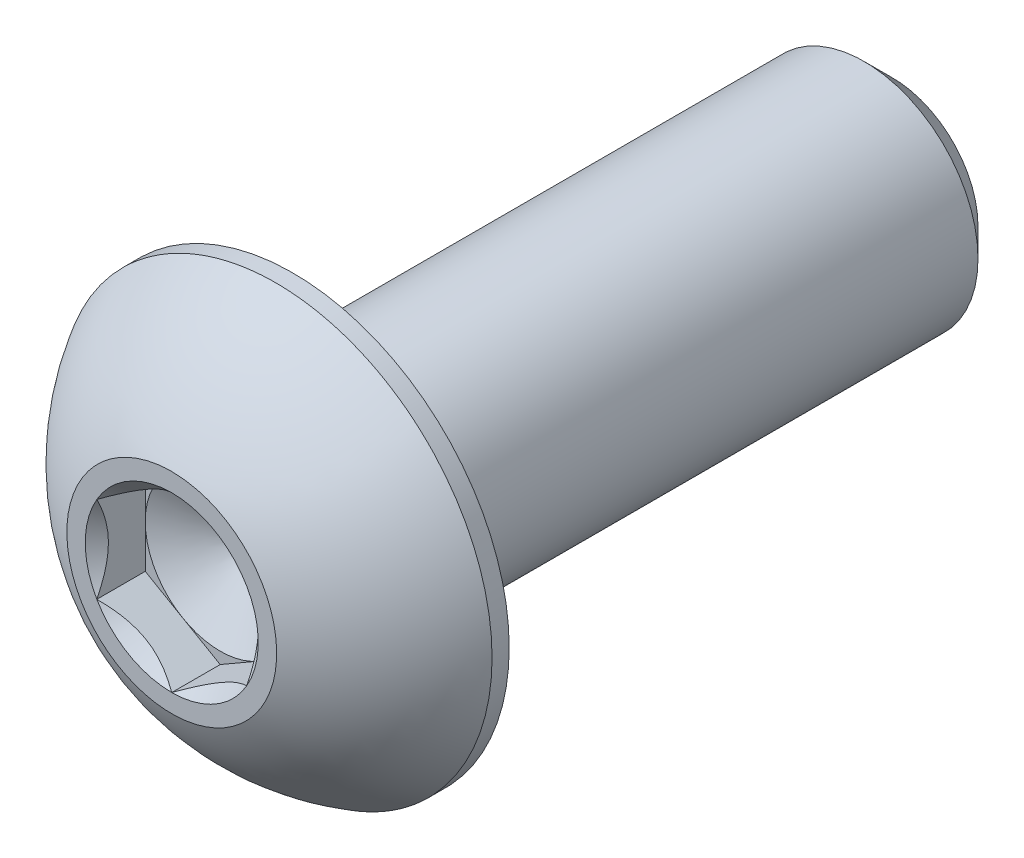
ISO-10303-21;
HEADER;
FILE_DESCRIPTION(('STEP AP214'),'2;1');
FILE_NAME('part.step','',(''),(''),'','','');
FILE_SCHEMA(('AUTOMOTIVE_DESIGN { 1 0 10303 214 1 1 1 1 }'));
ENDSEC;
DATA;
#1=APPLICATION_CONTEXT('core data for automotive mechanical design processes');
#2=APPLICATION_PROTOCOL_DEFINITION('international standard','automotive_design',2000,#1);
#3=PRODUCT_CONTEXT('',#1,'mechanical');
#4=PRODUCT('Part','Part','',(#3));
#5=PRODUCT_RELATED_PRODUCT_CATEGORY('part','',(#4));
#6=PRODUCT_DEFINITION_FORMATION('','',#4);
#7=PRODUCT_DEFINITION_CONTEXT('part definition',#1,'design');
#8=PRODUCT_DEFINITION('design','',#6,#7);
#9=PRODUCT_DEFINITION_SHAPE('','',#8);
#10=(LENGTH_UNIT() NAMED_UNIT(*) SI_UNIT(.MILLI.,.METRE.));
#11=(NAMED_UNIT(*) PLANE_ANGLE_UNIT() SI_UNIT($,.RADIAN.));
#12=(NAMED_UNIT(*) SI_UNIT($,.STERADIAN.) SOLID_ANGLE_UNIT());
#13=UNCERTAINTY_MEASURE_WITH_UNIT(LENGTH_MEASURE(1.E-05),#10,'distance_accuracy_value','');
#14=(GEOMETRIC_REPRESENTATION_CONTEXT(3) GLOBAL_UNCERTAINTY_ASSIGNED_CONTEXT((#13)) GLOBAL_UNIT_ASSIGNED_CONTEXT((#10,
#11,#12)) REPRESENTATION_CONTEXT('',''));
#15=CARTESIAN_POINT('',(0.,0.,0.));
#16=DIRECTION('',(0.,0.,1.));
#17=DIRECTION('',(1.,0.,0.));
#18=AXIS2_PLACEMENT_3D('',#15,#16,#17);
#19=CARTESIAN_POINT('',(0.,0.,6.60654000000704));
#20=DIRECTION('',(0.,0.,1.));
#21=DIRECTION('',(0.,-1.,0.));
#22=AXIS2_PLACEMENT_3D('',#19,#20,#21);
#23=CONICAL_SURFACE('',#22,1.58750000008467,1.04719755116523);
#24=CARTESIAN_POINT('',(1.98951966012828E-10,0.,5.68999644758605));
#25=VERTEX_POINT('',#24);
#26=VERTEX_LOOP('',#25);
#27=FACE_BOUND('',#26,.T.);
#28=CARTESIAN_POINT('',(0.,0.,6.60654000000704));
#29=DIRECTION('',(0.,0.,1.));
#30=DIRECTION('',(0.,-1.,0.));
#31=AXIS2_PLACEMENT_3D('',#28,#29,#30);
#32=CIRCLE('',#31,1.58750000008467);
#33=CARTESIAN_POINT('',(1.58750000003508,0.,6.60653999999107));
#34=VERTEX_POINT('',#33);
#35=CARTESIAN_POINT('',(0.793750000021169,-1.37481532854446,6.60654000000352));
#36=VERTEX_POINT('',#35);
#37=EDGE_CURVE('E20',#34,#36,#32,.F.);
#38=ORIENTED_EDGE('',*,*,#37,.F.);
#39=CARTESIAN_POINT('',(0.,0.,6.60654000000704));
#40=DIRECTION('',(0.,0.,1.));
#41=DIRECTION('',(0.,-1.,0.));
#42=AXIS2_PLACEMENT_3D('',#39,#40,#41);
#43=CIRCLE('',#42,1.58750000008467);
#44=CARTESIAN_POINT('',(0.793750000021167,1.37481532854446,6.60654000000352));
#45=VERTEX_POINT('',#44);
#46=EDGE_CURVE('E408',#45,#34,#43,.F.);
#47=ORIENTED_EDGE('',*,*,#46,.F.);
#48=CARTESIAN_POINT('',(0.,0.,6.60654000000704));
#49=DIRECTION('',(0.,0.,1.));
#50=DIRECTION('',(0.,-1.,0.));
#51=AXIS2_PLACEMENT_3D('',#48,#49,#50);
#52=CIRCLE('',#51,1.58750000008467);
#53=CARTESIAN_POINT('',(-0.793750000021169,1.37481532854446,6.60654000000352));
#54=VERTEX_POINT('',#53);
#55=EDGE_CURVE('E113',#54,#45,#52,.F.);
#56=ORIENTED_EDGE('',*,*,#55,.F.);
#57=CARTESIAN_POINT('',(0.,0.,6.60654000000704));
#58=DIRECTION('',(0.,0.,1.));
#59=DIRECTION('',(0.,-1.,0.));
#60=AXIS2_PLACEMENT_3D('',#57,#58,#59);
#61=CIRCLE('',#60,1.58750000008467);
#62=CARTESIAN_POINT('',(-1.58750000003508,0.,6.60653999999107));
#63=VERTEX_POINT('',#62);
#64=EDGE_CURVE('E412',#63,#54,#61,.F.);
#65=ORIENTED_EDGE('',*,*,#64,.F.);
#66=CARTESIAN_POINT('',(0.,0.,6.60654000000704));
#67=DIRECTION('',(0.,0.,1.));
#68=DIRECTION('',(0.,-1.,0.));
#69=AXIS2_PLACEMENT_3D('',#66,#67,#68);
#70=CIRCLE('',#69,1.58750000008467);
#71=CARTESIAN_POINT('',(-0.793750000021168,-1.37481532854446,6.60654000000352));
#72=VERTEX_POINT('',#71);
#73=EDGE_CURVE('E407',#72,#63,#70,.F.);
#74=ORIENTED_EDGE('',*,*,#73,.F.);
#75=CARTESIAN_POINT('',(0.,0.,6.60654000000704));
#76=DIRECTION('',(0.,0.,1.));
#77=DIRECTION('',(0.,-1.,0.));
#78=AXIS2_PLACEMENT_3D('',#75,#76,#77);
#79=CIRCLE('',#78,1.58750000008467);
#80=EDGE_CURVE('E404',#36,#72,#79,.F.);
#81=ORIENTED_EDGE('',*,*,#80,.F.);
#82=EDGE_LOOP('',(#38,#47,#56,#65,#74,#81));
#83=FACE_BOUND('',#82,.T.);
#84=ADVANCED_FACE('F17',(#27,#83),#23,.F.);
#85=CARTESIAN_POINT('',(0.,0.,6.60654));
#86=DIRECTION('',(0.,0.,1.));
#87=DIRECTION('',(1.,0.,0.));
#88=AXIS2_PLACEMENT_3D('',#85,#86,#87);
#89=PLANE('',#88);
#90=DIRECTION('',(0.,1.,0.));
#91=VECTOR('',#90,1.);
#92=CARTESIAN_POINT('',(-1.5875,0.91654355233853,6.60654));
#93=LINE('',#92,#91);
#94=CARTESIAN_POINT('',(-1.5875,-0.916543552338531,6.60654));
#95=VERTEX_POINT('',#94);
#96=EDGE_CURVE('E139',#95,#63,#93,.T.);
#97=ORIENTED_EDGE('',*,*,#96,.F.);
#98=DIRECTION('',(-0.866025403784439,0.5,0.));
#99=VECTOR('',#98,1.);
#100=CARTESIAN_POINT('',(-1.5875,-0.916543552338531,6.60654));
#101=LINE('',#100,#99);
#102=EDGE_CURVE('E163',#72,#95,#101,.T.);
#103=ORIENTED_EDGE('',*,*,#102,.F.);
#104=ORIENTED_EDGE('',*,*,#73,.T.);
#105=EDGE_LOOP('',(#97,#103,#104));
#106=FACE_BOUND('',#105,.T.);
#107=ADVANCED_FACE('F352',(#106),#89,.T.);
#108=CARTESIAN_POINT('',(0.,0.,6.60654));
#109=DIRECTION('',(0.,0.,1.));
#110=DIRECTION('',(1.,0.,0.));
#111=AXIS2_PLACEMENT_3D('',#108,#109,#110);
#112=PLANE('',#111);
#113=DIRECTION('',(-0.866025403784439,0.5,0.));
#114=VECTOR('',#113,1.);
#115=CARTESIAN_POINT('',(-1.5875,-0.916543552338531,6.60654));
#116=LINE('',#115,#114);
#117=CARTESIAN_POINT('',(0.,-1.83308710467706,6.60654));
#118=VERTEX_POINT('',#117);
#119=EDGE_CURVE('E85',#118,#72,#116,.T.);
#120=ORIENTED_EDGE('',*,*,#119,.F.);
#121=DIRECTION('',(-0.866025403784438,-0.5,0.));
#122=VECTOR('',#121,1.);
#123=CARTESIAN_POINT('',(0.,-1.83308710467706,6.60654));
#124=LINE('',#123,#122);
#125=EDGE_CURVE('E154',#36,#118,#124,.T.);
#126=ORIENTED_EDGE('',*,*,#125,.F.);
#127=ORIENTED_EDGE('',*,*,#80,.T.);
#128=EDGE_LOOP('',(#120,#126,#127));
#129=FACE_BOUND('',#128,.T.);
#130=ADVANCED_FACE('F349',(#129),#112,.T.);
#131=CARTESIAN_POINT('',(0.,0.,6.60654));
#132=DIRECTION('',(0.,0.,1.));
#133=DIRECTION('',(1.,0.,0.));
#134=AXIS2_PLACEMENT_3D('',#131,#132,#133);
#135=PLANE('',#134);
#136=DIRECTION('',(-0.866025403784438,-0.5,0.));
#137=VECTOR('',#136,1.);
#138=CARTESIAN_POINT('',(0.,-1.83308710467706,6.60654));
#139=LINE('',#138,#137);
#140=CARTESIAN_POINT('',(1.5875,-0.91654355233853,6.60654));
#141=VERTEX_POINT('',#140);
#142=EDGE_CURVE('E151',#141,#36,#139,.T.);
#143=ORIENTED_EDGE('',*,*,#142,.F.);
#144=DIRECTION('',(0.,-1.,0.));
#145=VECTOR('',#144,1.);
#146=CARTESIAN_POINT('',(1.5875,-0.916543552338531,6.60654));
#147=LINE('',#146,#145);
#148=EDGE_CURVE('E143',#34,#141,#147,.T.);
#149=ORIENTED_EDGE('',*,*,#148,.F.);
#150=ORIENTED_EDGE('',*,*,#37,.T.);
#151=EDGE_LOOP('',(#143,#149,#150));
#152=FACE_BOUND('',#151,.T.);
#153=ADVANCED_FACE('F346',(#152),#135,.T.);
#154=CARTESIAN_POINT('',(0.,0.,6.60654));
#155=DIRECTION('',(0.,0.,1.));
#156=DIRECTION('',(1.,0.,0.));
#157=AXIS2_PLACEMENT_3D('',#154,#155,#156);
#158=PLANE('',#157);
#159=DIRECTION('',(0.,-1.,0.));
#160=VECTOR('',#159,1.);
#161=CARTESIAN_POINT('',(1.5875,-0.916543552338531,6.60654));
#162=LINE('',#161,#160);
#163=CARTESIAN_POINT('',(1.5875,0.916543552338532,6.60654));
#164=VERTEX_POINT('',#163);
#165=EDGE_CURVE('E100',#164,#34,#162,.T.);
#166=ORIENTED_EDGE('',*,*,#165,.F.);
#167=DIRECTION('',(0.866025403784439,-0.499999999999999,0.));
#168=VECTOR('',#167,1.);
#169=CARTESIAN_POINT('',(1.5875,0.916543552338532,6.60654));
#170=LINE('',#169,#168);
#171=EDGE_CURVE('E115',#45,#164,#170,.T.);
#172=ORIENTED_EDGE('',*,*,#171,.F.);
#173=ORIENTED_EDGE('',*,*,#46,.T.);
#174=EDGE_LOOP('',(#166,#172,#173));
#175=FACE_BOUND('',#174,.T.);
#176=ADVANCED_FACE('F342',(#175),#158,.T.);
#177=CARTESIAN_POINT('',(0.,0.,6.60654));
#178=DIRECTION('',(0.,0.,1.));
#179=DIRECTION('',(1.,0.,0.));
#180=AXIS2_PLACEMENT_3D('',#177,#178,#179);
#181=PLANE('',#180);
#182=DIRECTION('',(0.866025403784438,0.500000000000001,0.));
#183=VECTOR('',#182,1.);
#184=CARTESIAN_POINT('',(0.,1.83308710467706,6.60654));
#185=LINE('',#184,#183);
#186=CARTESIAN_POINT('',(-1.5875,0.91654355233853,6.60654));
#187=VERTEX_POINT('',#186);
#188=EDGE_CURVE('E127',#187,#54,#185,.T.);
#189=ORIENTED_EDGE('',*,*,#188,.F.);
#190=DIRECTION('',(0.,1.,0.));
#191=VECTOR('',#190,1.);
#192=CARTESIAN_POINT('',(-1.5875,0.91654355233853,6.60654));
#193=LINE('',#192,#191);
#194=EDGE_CURVE('E94',#63,#187,#193,.T.);
#195=ORIENTED_EDGE('',*,*,#194,.F.);
#196=ORIENTED_EDGE('',*,*,#64,.T.);
#197=EDGE_LOOP('',(#189,#195,#196));
#198=FACE_BOUND('',#197,.T.);
#199=ADVANCED_FACE('F339',(#198),#181,.T.);
#200=CARTESIAN_POINT('',(0.,0.,6.60654));
#201=DIRECTION('',(0.,0.,1.));
#202=DIRECTION('',(1.,0.,0.));
#203=AXIS2_PLACEMENT_3D('',#200,#201,#202);
#204=PLANE('',#203);
#205=DIRECTION('',(0.866025403784439,-0.499999999999999,0.));
#206=VECTOR('',#205,1.);
#207=CARTESIAN_POINT('',(1.5875,0.916543552338532,6.60654));
#208=LINE('',#207,#206);
#209=CARTESIAN_POINT('',(0.,1.83308710467706,6.60654));
#210=VERTEX_POINT('',#209);
#211=EDGE_CURVE('E108',#210,#45,#208,.T.);
#212=ORIENTED_EDGE('',*,*,#211,.F.);
#213=DIRECTION('',(0.866025403784438,0.500000000000001,0.));
#214=VECTOR('',#213,1.);
#215=CARTESIAN_POINT('',(0.,1.83308710467706,6.60654));
#216=LINE('',#215,#214);
#217=EDGE_CURVE('E111',#54,#210,#216,.T.);
#218=ORIENTED_EDGE('',*,*,#217,.F.);
#219=ORIENTED_EDGE('',*,*,#55,.T.);
#220=EDGE_LOOP('',(#212,#218,#219));
#221=FACE_BOUND('',#220,.T.);
#222=ADVANCED_FACE('F109',(#221),#204,.T.);
#223=CARTESIAN_POINT('',(-1.5875,0.91654355233853,7.6327));
#224=DIRECTION('',(1.,0.,0.));
#225=DIRECTION('',(0.,0.,-1.));
#226=AXIS2_PLACEMENT_3D('',#223,#224,#225);
#227=PLANE('',#226);
#228=ORIENTED_EDGE('',*,*,#194,.T.);
#229=DIRECTION('',(0.,0.,1.));
#230=VECTOR('',#229,1.);
#231=CARTESIAN_POINT('',(-1.5875,0.91654355233853,7.6327));
#232=LINE('',#231,#230);
#233=CARTESIAN_POINT('',(-1.58750000002218,0.916543552351338,7.63270000001906));
#234=VERTEX_POINT('',#233);
#235=EDGE_CURVE('E129',#234,#187,#232,.F.);
#236=ORIENTED_EDGE('',*,*,#235,.F.);
#237=CARTESIAN_POINT('',(-1.5875,0.916543552358202,7.63270000000328));
#238=CARTESIAN_POINT('',(-1.5875,0.853539453373367,7.60122818235901));
#239=CARTESIAN_POINT('',(-1.5875,0.789481924496105,7.57160506277902));
#240=CARTESIAN_POINT('',(-1.5875,0.658862049387679,7.5173663954488));
#241=CARTESIAN_POINT('',(-1.5875,0.592287287987198,7.49278101621401));
#242=CARTESIAN_POINT('',(-1.5875,0.458042547306118,7.45066609609962));
#243=CARTESIAN_POINT('',(-1.5875,0.390406737684108,7.43303072952796));
#244=CARTESIAN_POINT('',(-1.5875,0.253646529238388,7.40586008865383));
#245=CARTESIAN_POINT('',(-1.5875,0.184526305240138,7.3963045400976));
#246=CARTESIAN_POINT('',(-1.5875,0.065394416524215,7.38768274185345));
#247=CARTESIAN_POINT('',(-1.5875,0.0155365509557984,7.38640682173813));
#248=CARTESIAN_POINT('',(-1.5875,-0.0840976089164383,7.38855913780551));
#249=CARTESIAN_POINT('',(-1.5875,-0.133873868507323,7.3919890228369));
#250=CARTESIAN_POINT('',(-1.5875,-0.232943743909917,7.40335631413622));
#251=CARTESIAN_POINT('',(-1.5875,-0.28223690457157,7.41129762016252));
#252=CARTESIAN_POINT('',(-1.5875,-0.379995839881387,7.43125627677186));
#253=CARTESIAN_POINT('',(-1.5875,-0.428461250143206,7.44327537622796));
#254=CARTESIAN_POINT('',(-1.5875,-0.552553397792707,7.47894383182219));
#255=CARTESIAN_POINT('',(-1.5875,-0.627411798337527,7.50527770748671));
#256=CARTESIAN_POINT('',(-1.5875,-0.737482851511766,7.54973061452339));
#257=CARTESIAN_POINT('',(-1.5875,-0.773754680844726,7.56534835925004));
#258=CARTESIAN_POINT('',(-1.5875,-0.845631639929595,7.5980094505484));
#259=CARTESIAN_POINT('',(-1.5875,-0.881237077158801,7.61505211876176));
#260=CARTESIAN_POINT('',(-1.5875,-0.916543552358202,7.63270000000328));
#261=B_SPLINE_CURVE_WITH_KNOTS('',3,(#237,#238,#239,#240,#241,#242,#243,#244,#245,#246,#247,
#248,#249,#250,#251,#252,#253,#254,#255,#256,#257,#258,#259,#260),.UNSPECIFIED.,.F.,.F.,(4,2,2,
2,2,2,2,2,2,2,2,4),(0.,0.21142792770149,0.424087197087132,0.633370156332374,0.842126401396687,
0.991537200935213,1.14100036531259,1.2905929255201,1.44024972385232,1.67781721404414,
1.79627069407121,1.91466809999945),.UNSPECIFIED.);
#262=CARTESIAN_POINT('',(-1.58750000004437,-0.916543552322751,7.63270000002398));
#263=VERTEX_POINT('',#262);
#264=EDGE_CURVE('E123',#234,#263,#261,.T.);
#265=ORIENTED_EDGE('',*,*,#264,.T.);
#266=DIRECTION('',(0.,0.,1.));
#267=VECTOR('',#266,1.);
#268=CARTESIAN_POINT('',(-1.5875,-0.916543552338531,7.6327));
#269=LINE('',#268,#267);
#270=EDGE_CURVE('E155',#95,#263,#269,.T.);
#271=ORIENTED_EDGE('',*,*,#270,.F.);
#272=ORIENTED_EDGE('',*,*,#96,.T.);
#273=EDGE_LOOP('',(#228,#236,#265,#271,#272));
#274=FACE_BOUND('',#273,.T.);
#275=ADVANCED_FACE('F333',(#274),#227,.T.);
#276=CARTESIAN_POINT('',(-1.5875,-0.916543552338531,7.6327));
#277=DIRECTION('',(0.5,0.866025403784439,0.));
#278=DIRECTION('',(-0.866025403784439,0.5,0.));
#279=AXIS2_PLACEMENT_3D('',#276,#277,#278);
#280=PLANE('',#279);
#281=ORIENTED_EDGE('',*,*,#102,.T.);
#282=ORIENTED_EDGE('',*,*,#270,.T.);
#283=CARTESIAN_POINT('',(-1.58750000001704,-0.916543552328696,7.63270000000328));
#284=CARTESIAN_POINT('',(-1.53293684975362,-0.948045601821113,7.60122818235901));
#285=CARTESIAN_POINT('',(-1.47746140244226,-0.980074366259744,7.57160506277902));
#286=CARTESIAN_POINT('',(-1.36434127235921,-1.04538430381396,7.5173663954488));
#287=CARTESIAN_POINT('',(-1.3066858377355,-1.0786716845142,7.49278101621401));
#288=CARTESIAN_POINT('',(-1.19042648198123,-1.14579405485474,7.45066609609962));
#289=CARTESIAN_POINT('',(-1.13185215264304,-1.17961195966574,7.43303072952796));
#290=CARTESIAN_POINT('',(-1.0134143379022,-1.2479920638886,7.40586008865383));
#291=CARTESIAN_POINT('',(-0.953554468004441,-1.28255217588773,7.3963045400976));
#292=CARTESIAN_POINT('',(-0.85038322597563,-1.34211812024569,7.38768274185345));
#293=CARTESIAN_POINT('',(-0.807205047814912,-1.3670470530299,7.38640682173813));
#294=CARTESIAN_POINT('',(-0.720919334280835,-1.41686413296602,7.38855913780551));
#295=CARTESIAN_POINT('',(-0.67781182896976,-1.44175226276146,7.3919890228369));
#296=CARTESIAN_POINT('',(-0.592014800121354,-1.49128720046276,7.40335631413622));
#297=CARTESIAN_POINT('',(-0.549325670755536,-1.51593378079358,7.41129762016252));
#298=CARTESIAN_POINT('',(-0.464663949330314,-1.56481324844849,7.43125627677186));
#299=CARTESIAN_POINT('',(-0.422691672838744,-1.5890459535794,7.44327537622795));
#300=CARTESIAN_POINT('',(-0.315224720564106,-1.65109202740415,7.47894383182219));
#301=CARTESIAN_POINT('',(-0.250395444005621,-1.68852122767656,7.50527770748671));
#302=CARTESIAN_POINT('',(-0.155071115735423,-1.74355675426368,7.54973061452339));
#303=CARTESIAN_POINT('',(-0.123658790091346,-1.76169266893016,7.56534835925004));
#304=CARTESIAN_POINT('',(-0.061411517577074,-1.79763114847259,7.5980094505484));
#305=CARTESIAN_POINT('',(-0.0305763044237301,-1.8154338670872,7.61505211876176));
#306=CARTESIAN_POINT('',(1.70368143177717E-11,-1.8330871046869,7.63270000000328));
#307=B_SPLINE_CURVE_WITH_KNOTS('',3,(#283,#284,#285,#286,#287,#288,#289,#290,#291,#292,#293,
#294,#295,#296,#297,#298,#299,#300,#301,#302,#303,#304,#305,#306),.UNSPECIFIED.,.F.,.F.,(4,2,2,
2,2,2,2,2,2,2,2,4),(0.,0.21142792770149,0.424087197087133,0.633370156332374,0.842126401396688,
0.991537200935214,1.1410003653126,1.2905929255201,1.44024972385232,1.67781721404414,
1.79627069407121,1.91466809999945),.UNSPECIFIED.);
#308=CARTESIAN_POINT('',(-3.58481045027758E-11,-1.83308710470759,7.63270000002398));
#309=VERTEX_POINT('',#308);
#310=EDGE_CURVE('E234',#263,#309,#307,.T.);
#311=ORIENTED_EDGE('',*,*,#310,.T.);
#312=DIRECTION('',(0.,0.,1.));
#313=VECTOR('',#312,1.);
#314=CARTESIAN_POINT('',(0.,-1.83308710467706,7.6327));
#315=LINE('',#314,#313);
#316=EDGE_CURVE('E144',#118,#309,#315,.T.);
#317=ORIENTED_EDGE('',*,*,#316,.F.);
#318=ORIENTED_EDGE('',*,*,#119,.T.);
#319=EDGE_LOOP('',(#281,#282,#311,#317,#318));
#320=FACE_BOUND('',#319,.T.);
#321=ADVANCED_FACE('F232',(#320),#280,.T.);
#322=CARTESIAN_POINT('',(0.,-1.83308710467706,7.6327));
#323=DIRECTION('',(-0.5,0.866025403784438,0.));
#324=DIRECTION('',(-0.866025403784438,-0.5,0.));
#325=AXIS2_PLACEMENT_3D('',#322,#323,#324);
#326=PLANE('',#325);
#327=ORIENTED_EDGE('',*,*,#125,.T.);
#328=ORIENTED_EDGE('',*,*,#316,.T.);
#329=CARTESIAN_POINT('',(-1.70341274209627E-11,-1.8330871046869,7.63270000000328));
#330=CARTESIAN_POINT('',(0.0545631502463818,-1.80158505519448,7.60122818235901));
#331=CARTESIAN_POINT('',(0.110038597557746,-1.76955629075585,7.57160506277902));
#332=CARTESIAN_POINT('',(0.223158727640793,-1.70424635320164,7.5173663954488));
#333=CARTESIAN_POINT('',(0.280814162264498,-1.6709589725014,7.49278101621401));
#334=CARTESIAN_POINT('',(0.397073518018768,-1.60383660216086,7.45066609609962));
#335=CARTESIAN_POINT('',(0.455647847356956,-1.57001869734985,7.43303072952796));
#336=CARTESIAN_POINT('',(0.574085662097805,-1.50163859312699,7.40586008865383));
#337=CARTESIAN_POINT('',(0.63394553199556,-1.46707848112787,7.3963045400976));
#338=CARTESIAN_POINT('',(0.737116774024371,-1.4075125367699,7.38768274185345));
#339=CARTESIAN_POINT('',(0.780294952185089,-1.38258360398569,7.38640682173813));
#340=CARTESIAN_POINT('',(0.866580665719166,-1.33276652404958,7.38855913780551));
#341=CARTESIAN_POINT('',(0.90968817103024,-1.30787839425413,7.3919890228369));
#342=CARTESIAN_POINT('',(0.995485199878646,-1.25834345655284,7.40335631413622));
#343=CARTESIAN_POINT('',(1.03817432924446,-1.23369687622201,7.41129762016252));
#344=CARTESIAN_POINT('',(1.12283605066969,-1.1848174085671,7.43125627677186));
#345=CARTESIAN_POINT('',(1.16480832716126,-1.16058470343619,7.44327537622796));
#346=CARTESIAN_POINT('',(1.27227527943589,-1.09853862961144,7.47894383182219));
#347=CARTESIAN_POINT('',(1.33710455599438,-1.06110942933903,7.50527770748671));
#348=CARTESIAN_POINT('',(1.43242888426458,-1.00607390275191,7.54973061452339));
#349=CARTESIAN_POINT('',(1.46384120990865,-0.987937988085433,7.56534835925004));
#350=CARTESIAN_POINT('',(1.52608848242293,-0.951999508542998,7.5980094505484));
#351=CARTESIAN_POINT('',(1.55692369557627,-0.934196789928396,7.61505211876176));
#352=CARTESIAN_POINT('',(1.58750000001704,-0.916543552328695,7.63270000000328));
#353=B_SPLINE_CURVE_WITH_KNOTS('',3,(#329,#330,#331,#332,#333,#334,#335,#336,#337,#338,#339,
#340,#341,#342,#343,#344,#345,#346,#347,#348,#349,#350,#351,#352),.UNSPECIFIED.,.F.,.F.,(4,2,2,
2,2,2,2,2,2,2,2,4),(0.,0.21142792770149,0.424087197087132,0.633370156332374,0.842126401396687,
0.991537200935213,1.14100036531259,1.2905929255201,1.44024972385232,1.67781721404414,
1.79627069407121,1.91466809999945),.UNSPECIFIED.);
#354=CARTESIAN_POINT('',(1.58750000000852,-0.916543552384844,7.63270000002398));
#355=VERTEX_POINT('',#354);
#356=EDGE_CURVE('E252',#309,#355,#353,.T.);
#357=ORIENTED_EDGE('',*,*,#356,.T.);
#358=DIRECTION('',(0.,0.,1.));
#359=VECTOR('',#358,1.);
#360=CARTESIAN_POINT('',(1.5875,-0.916543552338531,7.6327));
#361=LINE('',#360,#359);
#362=EDGE_CURVE('E116',#141,#355,#361,.T.);
#363=ORIENTED_EDGE('',*,*,#362,.F.);
#364=ORIENTED_EDGE('',*,*,#142,.T.);
#365=EDGE_LOOP('',(#327,#328,#357,#363,#364));
#366=FACE_BOUND('',#365,.T.);
#367=ADVANCED_FACE('F292',(#366),#326,.T.);
#368=CARTESIAN_POINT('',(1.5875,-0.916543552338531,7.6327));
#369=DIRECTION('',(-1.,0.,0.));
#370=DIRECTION('',(0.,-1.,0.));
#371=AXIS2_PLACEMENT_3D('',#368,#369,#370);
#372=PLANE('',#371);
#373=ORIENTED_EDGE('',*,*,#148,.T.);
#374=ORIENTED_EDGE('',*,*,#362,.T.);
#375=CARTESIAN_POINT('',(1.5875,-0.916543552358201,7.63270000000328));
#376=CARTESIAN_POINT('',(1.5875,-0.85395104275657,7.60143294693855));
#377=CARTESIAN_POINT('',(1.5875,-0.790318655188973,7.57199158151505));
#378=CARTESIAN_POINT('',(1.5875,-0.660541633663089,7.51802496403688));
#379=CARTESIAN_POINT('',(1.5875,-0.594383506073453,7.49353244851943));
#380=CARTESIAN_POINT('',(1.5875,-0.460155167714169,7.45123913828867));
#381=CARTESIAN_POINT('',(1.5875,-0.392092287372478,7.43341569666632));
#382=CARTESIAN_POINT('',(1.5875,-0.25447447300086,7.40597573778663));
#383=CARTESIAN_POINT('',(1.5875,-0.184924844086878,7.39633384183783));
#384=CARTESIAN_POINT('',(1.5875,-0.0959348173038403,7.38989288210872));
#385=CARTESIAN_POINT('',(1.5875,-0.0767574755197734,7.38885158045631));
#386=CARTESIAN_POINT('',(1.5875,-0.0383876515910005,7.38746146103199));
#387=CARTESIAN_POINT('',(1.5875,-0.0191951833461738,7.38711226708252));
#388=CARTESIAN_POINT('',(1.5875,0.0481761373886682,7.38711447205992));
#389=CARTESIAN_POINT('',(1.5875,0.0963693775085008,7.38931961839162));
#390=CARTESIAN_POINT('',(1.5875,0.192379976759672,7.3980092409906));
#391=CARTESIAN_POINT('',(1.5875,0.240197050167165,7.40449670198797));
#392=CARTESIAN_POINT('',(1.5875,0.383011002180369,7.42997698356217));
#393=CARTESIAN_POINT('',(1.5875,0.476967063071648,7.45498338087688));
#394=CARTESIAN_POINT('',(1.5875,0.628737189876526,7.50614002872377));
#395=CARTESIAN_POINT('',(1.5875,0.687787687833644,7.52888766214301));
#396=CARTESIAN_POINT('',(1.5875,0.803652764125754,7.5781891232211));
#397=CARTESIAN_POINT('',(1.5875,0.860482853243095,7.60470623442882));
#398=CARTESIAN_POINT('',(1.5875,0.916543552358202,7.63270000000328));
#399=B_SPLINE_CURVE_WITH_KNOTS('',3,(#375,#376,#377,#378,#379,#380,#381,#382,#383,#384,#385,
#386,#387,#388,#389,#390,#391,#392,#393,#394,#395,#396,#397,#398),.UNSPECIFIED.,.F.,.F.,(4,2,2,
2,2,2,2,2,2,2,2,4),(0.,0.210047204140293,0.421441388619187,0.632111059448983,0.842124830794843,
0.899732953414545,0.957309756007175,1.1018162138033,1.24642349764238,1.53683268064256,
1.72655304071369,1.91453812065854),.UNSPECIFIED.);
#400=CARTESIAN_POINT('',(1.58750000004437,0.916543552322752,7.63270000002398));
#401=VERTEX_POINT('',#400);
#402=EDGE_CURVE('E296',#355,#401,#399,.T.);
#403=ORIENTED_EDGE('',*,*,#402,.T.);
#404=DIRECTION('',(0.,0.,1.));
#405=VECTOR('',#404,1.);
#406=CARTESIAN_POINT('',(1.5875,0.916543552338532,7.6327));
#407=LINE('',#406,#405);
#408=EDGE_CURVE('E148',#164,#401,#407,.T.);
#409=ORIENTED_EDGE('',*,*,#408,.F.);
#410=ORIENTED_EDGE('',*,*,#165,.T.);
#411=EDGE_LOOP('',(#373,#374,#403,#409,#410));
#412=FACE_BOUND('',#411,.T.);
#413=ADVANCED_FACE('F288',(#412),#372,.T.);
#414=CARTESIAN_POINT('',(1.5875,0.916543552338532,7.6327));
#415=DIRECTION('',(-0.499999999999999,-0.866025403784439,0.));
#416=DIRECTION('',(0.866025403784439,-0.499999999999999,0.));
#417=AXIS2_PLACEMENT_3D('',#414,#415,#416);
#418=PLANE('',#417);
#419=ORIENTED_EDGE('',*,*,#171,.T.);
#420=ORIENTED_EDGE('',*,*,#408,.T.);
#421=CARTESIAN_POINT('',(1.58750000001704,0.916543552328696,7.63270000000328));
#422=CARTESIAN_POINT('',(1.53293684975362,0.948045601821113,7.60122818235901));
#423=CARTESIAN_POINT('',(1.47746140244226,0.980074366259744,7.57160506277902));
#424=CARTESIAN_POINT('',(1.36434127235921,1.04538430381396,7.5173663954488));
#425=CARTESIAN_POINT('',(1.3066858377355,1.0786716845142,7.49278101621401));
#426=CARTESIAN_POINT('',(1.19042648198123,1.14579405485474,7.45066609609962));
#427=CARTESIAN_POINT('',(1.13185215264305,1.17961195966574,7.43303072952796));
#428=CARTESIAN_POINT('',(1.0134143379022,1.2479920638886,7.40586008865383));
#429=CARTESIAN_POINT('',(0.953554468004441,1.28255217588773,7.3963045400976));
#430=CARTESIAN_POINT('',(0.85038322597563,1.34211812024569,7.38768274185345));
#431=CARTESIAN_POINT('',(0.807205047814912,1.3670470530299,7.38640682173813));
#432=CARTESIAN_POINT('',(0.720919334280835,1.41686413296602,7.38855913780551));
#433=CARTESIAN_POINT('',(0.67781182896976,1.44175226276146,7.3919890228369));
#434=CARTESIAN_POINT('',(0.592014800121354,1.49128720046276,7.40335631413622));
#435=CARTESIAN_POINT('',(0.549325670755535,1.51593378079358,7.41129762016252));
#436=CARTESIAN_POINT('',(0.464663949330314,1.56481324844849,7.43125627677186));
#437=CARTESIAN_POINT('',(0.422691672838743,1.5890459535794,7.44327537622796));
#438=CARTESIAN_POINT('',(0.315224720564106,1.65109202740415,7.47894383182219));
#439=CARTESIAN_POINT('',(0.250395444005621,1.68852122767656,7.50527770748671));
#440=CARTESIAN_POINT('',(0.155071115735423,1.74355675426368,7.54973061452339));
#441=CARTESIAN_POINT('',(0.123658790091346,1.76169266893016,7.56534835925004));
#442=CARTESIAN_POINT('',(0.0614115175770741,1.79763114847259,7.5980094505484));
#443=CARTESIAN_POINT('',(0.0305763044237302,1.8154338670872,7.61505211876176));
#444=CARTESIAN_POINT('',(-1.70364763963411E-11,1.8330871046869,7.63270000000328));
#445=B_SPLINE_CURVE_WITH_KNOTS('',3,(#421,#422,#423,#424,#425,#426,#427,#428,#429,#430,#431,
#432,#433,#434,#435,#436,#437,#438,#439,#440,#441,#442,#443,#444),.UNSPECIFIED.,.F.,.F.,(4,2,2,
2,2,2,2,2,2,2,2,4),(0.,0.21142792770149,0.424087197087132,0.633370156332374,0.842126401396688,
0.991537200935214,1.1410003653126,1.2905929255201,1.44024972385232,1.67781721404414,
1.79627069407121,1.91466809999945),.UNSPECIFIED.);
#446=CARTESIAN_POINT('',(3.58485290638372E-11,1.83308710470759,7.63270000002398));
#447=VERTEX_POINT('',#446);
#448=EDGE_CURVE('E35',#401,#447,#445,.T.);
#449=ORIENTED_EDGE('',*,*,#448,.T.);
#450=DIRECTION('',(0.,0.,1.));
#451=VECTOR('',#450,1.);
#452=CARTESIAN_POINT('',(0.,1.83308710467706,7.6327));
#453=LINE('',#452,#451);
#454=EDGE_CURVE('E118',#210,#447,#453,.T.);
#455=ORIENTED_EDGE('',*,*,#454,.F.);
#456=ORIENTED_EDGE('',*,*,#211,.T.);
#457=EDGE_LOOP('',(#419,#420,#449,#455,#456));
#458=FACE_BOUND('',#457,.T.);
#459=ADVANCED_FACE('F119',(#458),#418,.T.);
#460=CARTESIAN_POINT('',(0.,1.83308710467706,7.6327));
#461=DIRECTION('',(0.500000000000001,-0.866025403784438,0.));
#462=DIRECTION('',(0.866025403784438,0.500000000000001,0.));
#463=AXIS2_PLACEMENT_3D('',#460,#461,#462);
#464=PLANE('',#463);
#465=ORIENTED_EDGE('',*,*,#217,.T.);
#466=ORIENTED_EDGE('',*,*,#454,.T.);
#467=CARTESIAN_POINT('',(1.70346744346862E-11,1.8330871046869,7.63270000000328));
#468=CARTESIAN_POINT('',(-0.0545631502463814,1.80158505519448,7.60122818235901));
#469=CARTESIAN_POINT('',(-0.110038597557745,1.76955629075585,7.57160506277902));
#470=CARTESIAN_POINT('',(-0.223158727640793,1.70424635320164,7.5173663954488));
#471=CARTESIAN_POINT('',(-0.280814162264497,1.6709589725014,7.49278101621401));
#472=CARTESIAN_POINT('',(-0.397073518018767,1.60383660216086,7.45066609609962));
#473=CARTESIAN_POINT('',(-0.455647847356955,1.57001869734985,7.43303072952796));
#474=CARTESIAN_POINT('',(-0.574085662097804,1.50163859312699,7.40586008865383));
#475=CARTESIAN_POINT('',(-0.633945531995558,1.46707848112787,7.3963045400976));
#476=CARTESIAN_POINT('',(-0.737116774024369,1.4075125367699,7.38768274185345));
#477=CARTESIAN_POINT('',(-0.780294952185087,1.3825836039857,7.38640682173813));
#478=CARTESIAN_POINT('',(-0.866580665719164,1.33276652404958,7.38855913780551));
#479=CARTESIAN_POINT('',(-0.909688171030238,1.30787839425413,7.3919890228369));
#480=CARTESIAN_POINT('',(-0.995485199878644,1.25834345655284,7.40335631413622));
#481=CARTESIAN_POINT('',(-1.03817432924446,1.23369687622201,7.41129762016252));
#482=CARTESIAN_POINT('',(-1.12283605066968,1.1848174085671,7.43125627677186));
#483=CARTESIAN_POINT('',(-1.16480832716125,1.16058470343619,7.44327537622795));
#484=CARTESIAN_POINT('',(-1.27227527943589,1.09853862961144,7.47894383182219));
#485=CARTESIAN_POINT('',(-1.33710455599438,1.06110942933903,7.50527770748671));
#486=CARTESIAN_POINT('',(-1.43242888426458,1.00607390275191,7.54973061452339));
#487=CARTESIAN_POINT('',(-1.46384120990865,0.987937988085433,7.56534835925004));
#488=CARTESIAN_POINT('',(-1.52608848242292,0.951999508542998,7.5980094505484));
#489=CARTESIAN_POINT('',(-1.55692369557627,0.934196789928395,7.61505211876176));
#490=CARTESIAN_POINT('',(-1.58750000001704,0.916543552328694,7.63270000000328));
#491=B_SPLINE_CURVE_WITH_KNOTS('',3,(#467,#468,#469,#470,#471,#472,#473,#474,#475,#476,#477,
#478,#479,#480,#481,#482,#483,#484,#485,#486,#487,#488,#489,#490),.UNSPECIFIED.,.F.,.F.,(4,2,2,
2,2,2,2,2,2,2,2,4),(0.,0.21142792770149,0.424087197087132,0.633370156332373,0.842126401396686,
0.991537200935212,1.14100036531259,1.2905929255201,1.44024972385232,1.67781721404414,
1.79627069407121,1.91466809999945),.UNSPECIFIED.);
#492=EDGE_CURVE('E246',#447,#234,#491,.T.);
#493=ORIENTED_EDGE('',*,*,#492,.T.);
#494=ORIENTED_EDGE('',*,*,#235,.T.);
#495=ORIENTED_EDGE('',*,*,#188,.T.);
#496=EDGE_LOOP('',(#465,#466,#493,#494,#495));
#497=FACE_BOUND('',#496,.T.);
#498=ADVANCED_FACE('F125',(#497),#464,.T.);
#499=CARTESIAN_POINT('',(0.,0.,7.63270000010152));
#500=DIRECTION('',(0.,0.,1.));
#501=DIRECTION('',(1.,0.,0.));
#502=AXIS2_PLACEMENT_3D('',#499,#500,#501);
#503=CONICAL_SURFACE('',#502,1.83308710478514,0.785398163397448);
#504=ORIENTED_EDGE('',*,*,#264,.F.);
#505=CARTESIAN_POINT('',(0.,0.,7.63270000004468));
#506=DIRECTION('',(0.,0.,1.));
#507=DIRECTION('',(1.,0.,0.));
#508=AXIS2_PLACEMENT_3D('',#505,#506,#507);
#509=CIRCLE('',#508,1.83308710472829);
#510=EDGE_CURVE('E239',#234,#263,#509,.T.);
#511=ORIENTED_EDGE('',*,*,#510,.T.);
#512=EDGE_LOOP('',(#504,#511));
#513=FACE_BOUND('',#512,.T.);
#514=ADVANCED_FACE('F240',(#513),#503,.F.);
#515=CARTESIAN_POINT('',(0.,0.,7.63270000010152));
#516=DIRECTION('',(0.,0.,1.));
#517=DIRECTION('',(1.,0.,0.));
#518=AXIS2_PLACEMENT_3D('',#515,#516,#517);
#519=CONICAL_SURFACE('',#518,1.83308710478514,0.785398163397448);
#520=ORIENTED_EDGE('',*,*,#310,.F.);
#521=CARTESIAN_POINT('',(0.,0.,7.63270000004468));
#522=DIRECTION('',(0.,0.,1.));
#523=DIRECTION('',(1.,0.,0.));
#524=AXIS2_PLACEMENT_3D('',#521,#522,#523);
#525=CIRCLE('',#524,1.83308710472829);
#526=EDGE_CURVE('E245',#263,#309,#525,.T.);
#527=ORIENTED_EDGE('',*,*,#526,.T.);
#528=EDGE_LOOP('',(#520,#527));
#529=FACE_BOUND('',#528,.T.);
#530=ADVANCED_FACE('F250',(#529),#519,.F.);
#531=CARTESIAN_POINT('',(0.,0.,7.63270000010152));
#532=DIRECTION('',(0.,0.,1.));
#533=DIRECTION('',(1.,0.,0.));
#534=AXIS2_PLACEMENT_3D('',#531,#532,#533);
#535=CONICAL_SURFACE('',#534,1.83308710478514,0.785398163397448);
#536=ORIENTED_EDGE('',*,*,#356,.F.);
#537=CARTESIAN_POINT('',(0.,0.,7.63270000004468));
#538=DIRECTION('',(0.,0.,1.));
#539=DIRECTION('',(1.,0.,0.));
#540=AXIS2_PLACEMENT_3D('',#537,#538,#539);
#541=CIRCLE('',#540,1.83308710472829);
#542=EDGE_CURVE('E259',#309,#355,#541,.T.);
#543=ORIENTED_EDGE('',*,*,#542,.T.);
#544=EDGE_LOOP('',(#536,#543));
#545=FACE_BOUND('',#544,.T.);
#546=ADVANCED_FACE('F312',(#545),#535,.F.);
#547=CARTESIAN_POINT('',(0.,0.,7.63270000010152));
#548=DIRECTION('',(0.,0.,1.));
#549=DIRECTION('',(1.,0.,0.));
#550=AXIS2_PLACEMENT_3D('',#547,#548,#549);
#551=CONICAL_SURFACE('',#550,1.83308710478514,0.785398163397448);
#552=ORIENTED_EDGE('',*,*,#402,.F.);
#553=CARTESIAN_POINT('',(0.,0.,7.63270000004468));
#554=DIRECTION('',(0.,0.,1.));
#555=DIRECTION('',(1.,0.,0.));
#556=AXIS2_PLACEMENT_3D('',#553,#554,#555);
#557=CIRCLE('',#556,1.83308710472829);
#558=EDGE_CURVE('E261',#355,#401,#557,.T.);
#559=ORIENTED_EDGE('',*,*,#558,.T.);
#560=EDGE_LOOP('',(#552,#559));
#561=FACE_BOUND('',#560,.T.);
#562=ADVANCED_FACE('F308',(#561),#551,.F.);
#563=CARTESIAN_POINT('',(0.,0.,7.63270000010152));
#564=DIRECTION('',(0.,0.,1.));
#565=DIRECTION('',(1.,0.,0.));
#566=AXIS2_PLACEMENT_3D('',#563,#564,#565);
#567=CONICAL_SURFACE('',#566,1.83308710478514,0.785398163397448);
#568=ORIENTED_EDGE('',*,*,#448,.F.);
#569=CARTESIAN_POINT('',(0.,0.,7.63270000004468));
#570=DIRECTION('',(0.,0.,1.));
#571=DIRECTION('',(1.,0.,0.));
#572=AXIS2_PLACEMENT_3D('',#569,#570,#571);
#573=CIRCLE('',#572,1.83308710472829);
#574=EDGE_CURVE('E398',#401,#447,#573,.T.);
#575=ORIENTED_EDGE('',*,*,#574,.T.);
#576=EDGE_LOOP('',(#568,#575));
#577=FACE_BOUND('',#576,.T.);
#578=ADVANCED_FACE('F311',(#577),#567,.F.);
#579=CARTESIAN_POINT('',(0.,0.,7.63270000010152));
#580=DIRECTION('',(0.,0.,1.));
#581=DIRECTION('',(1.,0.,0.));
#582=AXIS2_PLACEMENT_3D('',#579,#580,#581);
#583=CONICAL_SURFACE('',#582,1.83308710478514,0.785398163397448);
#584=ORIENTED_EDGE('',*,*,#492,.F.);
#585=CARTESIAN_POINT('',(0.,0.,7.63270000004468));
#586=DIRECTION('',(0.,0.,1.));
#587=DIRECTION('',(1.,0.,0.));
#588=AXIS2_PLACEMENT_3D('',#585,#586,#587);
#589=CIRCLE('',#588,1.83308710472829);
#590=EDGE_CURVE('E194',#447,#234,#589,.T.);
#591=ORIENTED_EDGE('',*,*,#590,.T.);
#592=EDGE_LOOP('',(#584,#591));
#593=FACE_BOUND('',#592,.T.);
#594=ADVANCED_FACE('F278',(#593),#583,.F.);
#595=CARTESIAN_POINT('',(0.,1.5875,7.6327));
#596=DIRECTION('',(0.,0.,-1.));
#597=DIRECTION('',(-1.,0.,0.));
#598=AXIS2_PLACEMENT_3D('',#595,#596,#597);
#599=PLANE('',#598);
#600=ORIENTED_EDGE('',*,*,#574,.F.);
#601=ORIENTED_EDGE('',*,*,#558,.F.);
#602=ORIENTED_EDGE('',*,*,#542,.F.);
#603=ORIENTED_EDGE('',*,*,#526,.F.);
#604=ORIENTED_EDGE('',*,*,#510,.F.);
#605=ORIENTED_EDGE('',*,*,#590,.F.);
#606=EDGE_LOOP('',(#600,#601,#602,#603,#604,#605));
#607=FACE_BOUND('',#606,.T.);
#608=CARTESIAN_POINT('',(0.,2.2225,7.6327));
#609=CARTESIAN_POINT('',(0.062400830236428,2.22249962605221,7.63270000000001));
#610=CARTESIAN_POINT('',(0.124813128311019,2.21986962095672,7.63270000000003));
#611=CARTESIAN_POINT('',(0.249206417298754,2.20936669931514,7.63269999999997));
#612=CARTESIAN_POINT('',(0.311187275416085,2.20149223489734,7.63269999999989));
#613=CARTESIAN_POINT('',(0.434369637431306,2.18053582210497,7.63270000000011));
#614=CARTESIAN_POINT('',(0.495569744276043,2.16744560744352,7.63270000000041));
#615=CARTESIAN_POINT('',(0.616683688787432,2.13614792724308,7.63269999999959));
#616=CARTESIAN_POINT('',(0.676596439991351,2.11793630902187,7.63269999999848));
#617=CARTESIAN_POINT('',(0.853505349098927,2.05587113455764,7.63269999999747));
#618=CARTESIAN_POINT('',(0.967969885248869,2.00453627916372,7.63269999999989));
#619=CARTESIAN_POINT('',(1.18664316010392,1.88335101663532,7.6327000000001));
#620=CARTESIAN_POINT('',(1.29085150873609,1.81349990564611,7.6326999999979));
#621=CARTESIAN_POINT('',(1.43720780844397,1.69642628720797,7.6326999999987));
#622=CARTESIAN_POINT('',(1.48436144118721,1.65532134615803,7.63269999999965));
#623=CARTESIAN_POINT('',(1.5750058299644,1.56931768980706,7.63270000000035));
#624=CARTESIAN_POINT('',(1.61850007372981,1.5244226704864,7.63270000000009));
#625=CARTESIAN_POINT('',(1.70157089948496,1.43110667860197,7.63269999999991));
#626=CARTESIAN_POINT('',(1.74114569788169,1.38268411802348,7.63269999999997));
#627=CARTESIAN_POINT('',(1.81607937282639,1.2826816728376,7.63270000000003));
#628=CARTESIAN_POINT('',(1.85143727079623,1.23110105955583,7.63270000000001));
#629=CARTESIAN_POINT('',(1.95076738927649,1.07218457212972,7.63269999999998));
#630=CARTESIAN_POINT('',(2.00808366205909,0.960575433380765,7.6327));
#631=CARTESIAN_POINT('',(2.10313020676176,0.729378863140994,7.6327));
#632=CARTESIAN_POINT('',(2.14086068786724,0.609791516876562,7.6327));
#633=CARTESIAN_POINT('',(2.19571923872775,0.365964364561337,7.6327));
#634=CARTESIAN_POINT('',(2.21284719845658,0.241724533667953,7.6327));
#635=CARTESIAN_POINT('',(2.2259967615882,-0.00786710194082934,7.6327));
#636=CARTESIAN_POINT('',(2.222018364991,-0.133218906656229,7.6327));
#637=CARTESIAN_POINT('',(2.19308412307952,-0.381460624450985,7.6327));
#638=CARTESIAN_POINT('',(2.16812838979274,-0.504350550674185,7.6327));
#639=CARTESIAN_POINT('',(2.09790144782383,-0.744254440538946,7.6327));
#640=CARTESIAN_POINT('',(2.05263002215899,-0.861268341406499,7.6327));
#641=CARTESIAN_POINT('',(1.97054824816561,-1.02974238923351,7.6327));
#642=CARTESIAN_POINT('',(1.9408060225289,-1.08475275761561,7.6327));
#643=CARTESIAN_POINT('',(1.87679512687846,-1.19207540164683,7.6327));
#644=CARTESIAN_POINT('',(1.84252750659245,-1.24438829911046,7.6327));
#645=CARTESIAN_POINT('',(1.76972191442719,-1.34591653253569,7.6327));
#646=CARTESIAN_POINT('',(1.73118588313091,-1.39513326030638,7.6327));
#647=CARTESIAN_POINT('',(1.65008029646333,-1.49018544562468,7.6327));
#648=CARTESIAN_POINT('',(1.60750688430593,-1.53601759413277,7.6327));
#649=CARTESIAN_POINT('',(1.47426253999857,-1.66782177960708,7.63269999999999));
#650=CARTESIAN_POINT('',(1.37797082186376,-1.74823609829318,7.6327));
#651=CARTESIAN_POINT('',(1.17324188156876,-1.89172801442616,7.6327));
#652=CARTESIAN_POINT('',(1.06480512128103,-1.95480627084362,7.6327));
#653=CARTESIAN_POINT('',(0.895397183662164,-2.03511690945873,7.6327));
#654=CARTESIAN_POINT('',(0.837729725467275,-2.059523159896,7.6327));
#655=CARTESIAN_POINT('',(0.720574921776893,-2.1033738647174,7.6327));
#656=CARTESIAN_POINT('',(0.66108909308082,-2.12282233463267,7.6327));
#657=CARTESIAN_POINT('',(0.540790693462946,-2.15660636337686,7.6327));
#658=CARTESIAN_POINT('',(0.479980380456674,-2.17094999593314,7.6327));
#659=CARTESIAN_POINT('',(0.357379336324735,-2.19446564361659,7.6327));
#660=CARTESIAN_POINT('',(0.295588899905396,-2.2036391840928,7.6327));
#661=CARTESIAN_POINT('',(0.194752244532459,-2.21429438764149,7.6327));
#662=CARTESIAN_POINT('',(0.155867472196769,-2.21737051850839,7.6327));
#663=CARTESIAN_POINT('',(0.0779899595294864,-2.22147344153644,7.6327));
#664=CARTESIAN_POINT('',(0.0389972191978944,-2.2225002336976,7.6327));
#665=CARTESIAN_POINT('',(-0.0624008302364293,-2.22249962605221,7.63270000000001));
#666=CARTESIAN_POINT('',(-0.12481312831102,-2.21986962095672,7.63270000000003));
#667=CARTESIAN_POINT('',(-0.249206417298756,-2.20936669931514,7.63269999999997));
#668=CARTESIAN_POINT('',(-0.311187275416087,-2.20149223489735,7.63269999999989));
#669=CARTESIAN_POINT('',(-0.434369637431307,-2.18053582210497,7.63270000000011));
#670=CARTESIAN_POINT('',(-0.495569744276044,-2.16744560744352,7.63270000000041));
#671=CARTESIAN_POINT('',(-0.616683688787433,-2.13614792724308,7.63269999999959));
#672=CARTESIAN_POINT('',(-0.676596439991352,-2.11793630902188,7.63269999999848));
#673=CARTESIAN_POINT('',(-0.853505349098928,-2.05587113455764,7.63269999999747));
#674=CARTESIAN_POINT('',(-0.967969885248871,-2.00453627916373,7.63269999999989));
#675=CARTESIAN_POINT('',(-1.18664316010393,-1.88335101663533,7.6327000000001));
#676=CARTESIAN_POINT('',(-1.29085150873609,-1.81349990564611,7.6326999999979));
#677=CARTESIAN_POINT('',(-1.43720780844397,-1.69642628720797,7.6326999999987));
#678=CARTESIAN_POINT('',(-1.48436144118721,-1.65532134615804,7.63269999999965));
#679=CARTESIAN_POINT('',(-1.5750058299644,-1.56931768980706,7.63270000000035));
#680=CARTESIAN_POINT('',(-1.61850007372981,-1.5244226704864,7.63270000000009));
#681=CARTESIAN_POINT('',(-1.70157089948496,-1.43110667860198,7.63269999999991));
#682=CARTESIAN_POINT('',(-1.74114569788169,-1.38268411802348,7.63269999999997));
#683=CARTESIAN_POINT('',(-1.81607937282639,-1.28268167283761,7.63270000000003));
#684=CARTESIAN_POINT('',(-1.85143727079623,-1.23110105955583,7.63270000000001));
#685=CARTESIAN_POINT('',(-1.95076738927649,-1.07218457212973,7.63269999999998));
#686=CARTESIAN_POINT('',(-2.00808366205909,-0.960575433380768,7.6327));
#687=CARTESIAN_POINT('',(-2.10313020676176,-0.729378863140996,7.6327));
#688=CARTESIAN_POINT('',(-2.14086068786724,-0.609791516876566,7.63269999999999));
#689=CARTESIAN_POINT('',(-2.19571923872775,-0.365964364561341,7.63269999999999));
#690=CARTESIAN_POINT('',(-2.21284719845658,-0.241724533667957,7.6327));
#691=CARTESIAN_POINT('',(-2.2259967615882,0.00786710194082657,7.6327));
#692=CARTESIAN_POINT('',(-2.222018364991,0.133218906656226,7.6327));
#693=CARTESIAN_POINT('',(-2.19308412307952,0.381460624450982,7.6327));
#694=CARTESIAN_POINT('',(-2.16812838979274,0.504350550674182,7.6327));
#695=CARTESIAN_POINT('',(-2.09790144782383,0.744254440538943,7.6327));
#696=CARTESIAN_POINT('',(-2.05263002215899,0.861268341406496,7.6327));
#697=CARTESIAN_POINT('',(-1.97054824816561,1.02974238923351,7.6327));
#698=CARTESIAN_POINT('',(-1.94080602252889,1.0847527576156,7.6327));
#699=CARTESIAN_POINT('',(-1.87679512687846,1.19207540164683,7.6327));
#700=CARTESIAN_POINT('',(-1.84252750659245,1.24438829911045,7.6327));
#701=CARTESIAN_POINT('',(-1.76972191442719,1.34591653253568,7.6327));
#702=CARTESIAN_POINT('',(-1.73118588313091,1.39513326030637,7.6327));
#703=CARTESIAN_POINT('',(-1.65008029646333,1.49018544562468,7.6327));
#704=CARTESIAN_POINT('',(-1.60750688430593,1.53601759413276,7.6327));
#705=CARTESIAN_POINT('',(-1.47426253999857,1.66782177960708,7.63269999999999));
#706=CARTESIAN_POINT('',(-1.37797082186376,1.74823609829317,7.6327));
#707=CARTESIAN_POINT('',(-1.17324188156876,1.89172801442616,7.6327));
#708=CARTESIAN_POINT('',(-1.06480512128103,1.95480627084362,7.6327));
#709=CARTESIAN_POINT('',(-0.895397183662163,2.03511690945873,7.6327));
#710=CARTESIAN_POINT('',(-0.837729725467273,2.05952315989599,7.6327));
#711=CARTESIAN_POINT('',(-0.720574921776891,2.10337386471739,7.6327));
#712=CARTESIAN_POINT('',(-0.661089093080819,2.12282233463267,7.6327));
#713=CARTESIAN_POINT('',(-0.540790693462944,2.15660636337686,7.6327));
#714=CARTESIAN_POINT('',(-0.479980380456671,2.17094999593314,7.6327));
#715=CARTESIAN_POINT('',(-0.357379336324732,2.19446564361658,7.6327));
#716=CARTESIAN_POINT('',(-0.295588899905393,2.20363918409279,7.6327));
#717=CARTESIAN_POINT('',(-0.194752244532457,2.21429438764149,7.6327));
#718=CARTESIAN_POINT('',(-0.155867472196767,2.21737051850838,7.6327));
#719=CARTESIAN_POINT('',(-0.0779899595294861,2.22147344153644,7.6327));
#720=CARTESIAN_POINT('',(-0.0389972191978949,2.2225002336976,7.6327));
#721=CARTESIAN_POINT('',(0.,2.2225,7.6327));
#722=B_SPLINE_CURVE_WITH_KNOTS('',3,(#608,#609,#610,#611,#612,#613,#614,#615,#616,#617,#618,
#619,#620,#621,#622,#623,#624,#625,#626,#627,#628,#629,#630,#631,#632,#633,#634,#635,#636,#637,
#638,#639,#640,#641,#642,#643,#644,#645,#646,#647,#648,#649,#650,#651,#652,#653,#654,#655,#656,
#657,#658,#659,#660,#661,#662,#663,#664,#665,#666,#667,#668,#669,#670,#671,#672,#673,#674,#675,
#676,#677,#678,#679,#680,#681,#682,#683,#684,#685,#686,#687,#688,#689,#690,#691,#692,#693,#694,
#695,#696,#697,#698,#699,#700,#701,#702,#703,#704,#705,#706,#707,#708,#709,#710,#711,#712,#713,
#714,#715,#716,#717,#718,#719,#720,#721),.UNSPECIFIED.,.T.,.F.,(4,2,2,2,2,2,2,2,2,2,2,2,2,2,2,2,
2,2,2,2,2,2,2,2,2,2,2,2,2,2,2,2,2,2,2,2,2,2,2,2,2,2,2,2,2,2,2,2,2,2,2,2,2,2,2,2,4),(0.,
0.187166590072886,0.374388445772405,0.561908211630432,0.74958046820461,1.12403036987818,
1.49849450748271,1.6859719202418,1.87326857653801,2.06065007664896,2.24807497643521,
2.62253399581486,2.99698901571479,3.3714460353546,3.74590305499445,4.12035807489442,
4.49481709427403,4.68224199406002,4.86962349417068,5.05692015046667,5.24439756322555,
5.61886170083035,5.99331160250425,6.18098385907871,6.36850362493696,6.55572548063659,
6.74289207070962,6.85986129230394,6.97683051389827,7.16399710397115,7.35121895967067,
7.5387387255287,7.72641098210288,8.10086088377645,8.47532502138098,8.66280243414007,
8.85009909043628,9.03748059054723,9.22490549033347,9.59936450971313,9.97381952961306,
10.3482765492529,10.7227335688927,11.0971885887927,11.4716476081723,11.6590725079583,
11.846454008069,12.0337506643649,12.2212280771238,12.5956922147286,12.9701421164025,
13.157814372977,13.3453341388352,13.5325559945349,13.7197225846079,13.8366918062022,
13.9536610277965),.UNSPECIFIED.);
#723=CARTESIAN_POINT('',(0.,2.2225,7.6327));
#724=VERTEX_POINT('',#723);
#725=EDGE_CURVE('E186',#724,#724,#722,.T.);
#726=ORIENTED_EDGE('',*,*,#725,.F.);
#727=EDGE_LOOP('',(#726));
#728=FACE_BOUND('',#727,.T.);
#729=ADVANCED_FACE('F196',(#607,#728),#599,.F.);
#730=CARTESIAN_POINT('',(0.,0.,2.8811096257943));
#731=DIRECTION('',(0.,1.,0.));
#732=DIRECTION('',(0.,0.,-1.));
#733=AXIS2_PLACEMENT_3D('',#730,#731,#732);
#734=SPHERICAL_SURFACE('',#733,5.24567606074224);
#735=CARTESIAN_POINT('',(0.,0.,5.43015714285714));
#736=DIRECTION('',(0.,0.,1.));
#737=DIRECTION('',(1.,0.,0.));
#738=AXIS2_PLACEMENT_3D('',#735,#736,#737);
#739=CIRCLE('',#738,4.5847);
#740=CARTESIAN_POINT('',(4.5847,0.,5.43015714285714));
#741=VERTEX_POINT('',#740);
#742=EDGE_CURVE('E183',#741,#741,#739,.F.);
#743=ORIENTED_EDGE('',*,*,#742,.F.);
#744=EDGE_LOOP('',(#743));
#745=FACE_BOUND('',#744,.T.);
#746=ORIENTED_EDGE('',*,*,#725,.T.);
#747=EDGE_LOOP('',(#746));
#748=FACE_BOUND('',#747,.T.);
#749=ADVANCED_FACE('F199',(#745,#748),#734,.T.);
#750=CARTESIAN_POINT('',(0.,1.8176748,-7.6327));
#751=DIRECTION('',(0.,0.,1.));
#752=DIRECTION('',(1.,0.,0.));
#753=AXIS2_PLACEMENT_3D('',#750,#751,#752);
#754=PLANE('',#753);
#755=CARTESIAN_POINT('',(0.,0.,-7.63269999998784));
#756=DIRECTION('',(0.,0.,1.));
#757=DIRECTION('',(1.,0.,0.));
#758=AXIS2_PLACEMENT_3D('',#755,#756,#757);
#759=CIRCLE('',#758,1.81767480000872);
#760=CARTESIAN_POINT('',(1.81767480000872,0.,-7.63269999998784));
#761=VERTEX_POINT('',#760);
#762=EDGE_CURVE('E180',#761,#761,#759,.T.);
#763=ORIENTED_EDGE('',*,*,#762,.F.);
#764=EDGE_LOOP('',(#763));
#765=FACE_BOUND('',#764,.T.);
#766=ADVANCED_FACE('F204',(#765),#754,.F.);
#767=CARTESIAN_POINT('',(0.,0.,7.6327));
#768=DIRECTION('',(0.,0.,1.));
#769=DIRECTION('',(1.,0.,0.));
#770=AXIS2_PLACEMENT_3D('',#767,#768,#769);
#771=CYLINDRICAL_SURFACE('',#770,4.5847);
#772=ORIENTED_EDGE('',*,*,#742,.T.);
#773=EDGE_LOOP('',(#772));
#774=FACE_BOUND('',#773,.T.);
#775=CARTESIAN_POINT('',(0.,0.,5.0673));
#776=DIRECTION('',(0.,0.,1.));
#777=DIRECTION('',(1.,0.,0.));
#778=AXIS2_PLACEMENT_3D('',#775,#776,#777);
#779=CIRCLE('',#778,4.5847);
#780=CARTESIAN_POINT('',(4.5847,0.,5.0673));
#781=VERTEX_POINT('',#780);
#782=EDGE_CURVE('E177',#781,#781,#779,.T.);
#783=ORIENTED_EDGE('',*,*,#782,.T.);
#784=EDGE_LOOP('',(#783));
#785=FACE_BOUND('',#784,.T.);
#786=ADVANCED_FACE('F374',(#774,#785),#771,.T.);
#787=CARTESIAN_POINT('',(0.,0.,-7.03737480000655));
#788=DIRECTION('',(0.,0.,1.));
#789=DIRECTION('',(1.,0.,0.));
#790=AXIS2_PLACEMENT_3D('',#787,#788,#789);
#791=CONICAL_SURFACE('',#790,2.41299999999001,0.785398163397448);
#792=CARTESIAN_POINT('',(0.,0.,-7.0373748));
#793=DIRECTION('',(0.,0.,1.));
#794=DIRECTION('',(1.,0.,0.));
#795=AXIS2_PLACEMENT_3D('',#792,#793,#794);
#796=CIRCLE('',#795,2.413);
#797=CARTESIAN_POINT('',(2.413,0.,-7.0373748));
#798=VERTEX_POINT('',#797);
#799=EDGE_CURVE('E26',#798,#798,#796,.T.);
#800=ORIENTED_EDGE('',*,*,#799,.F.);
#801=EDGE_LOOP('',(#800));
#802=FACE_BOUND('',#801,.T.);
#803=ORIENTED_EDGE('',*,*,#762,.T.);
#804=EDGE_LOOP('',(#803));
#805=FACE_BOUND('',#804,.T.);
#806=ADVANCED_FACE('F368',(#802,#805),#791,.T.);
#807=CARTESIAN_POINT('',(0.,4.5847,5.0673));
#808=DIRECTION('',(0.,0.,1.));
#809=DIRECTION('',(1.,0.,0.));
#810=AXIS2_PLACEMENT_3D('',#807,#808,#809);
#811=PLANE('',#810);
#812=CARTESIAN_POINT('',(0.,0.,5.0673));
#813=DIRECTION('',(0.,0.,1.));
#814=DIRECTION('',(1.,0.,0.));
#815=AXIS2_PLACEMENT_3D('',#812,#813,#814);
#816=CIRCLE('',#815,2.413);
#817=CARTESIAN_POINT('',(2.413,0.,5.0673));
#818=VERTEX_POINT('',#817);
#819=EDGE_CURVE('E11',#818,#818,#816,.F.);
#820=ORIENTED_EDGE('',*,*,#819,.F.);
#821=EDGE_LOOP('',(#820));
#822=FACE_BOUND('',#821,.T.);
#823=ORIENTED_EDGE('',*,*,#782,.F.);
#824=EDGE_LOOP('',(#823));
#825=FACE_BOUND('',#824,.T.);
#826=ADVANCED_FACE('F362',(#822,#825),#811,.F.);
#827=CARTESIAN_POINT('',(0.,0.,7.6327));
#828=DIRECTION('',(0.,0.,1.));
#829=DIRECTION('',(1.,0.,0.));
#830=AXIS2_PLACEMENT_3D('',#827,#828,#829);
#831=CYLINDRICAL_SURFACE('',#830,2.413);
#832=ORIENTED_EDGE('',*,*,#819,.T.);
#833=EDGE_LOOP('',(#832));
#834=FACE_BOUND('',#833,.T.);
#835=ORIENTED_EDGE('',*,*,#799,.T.);
#836=EDGE_LOOP('',(#835));
#837=FACE_BOUND('',#836,.T.);
#838=ADVANCED_FACE('F360',(#834,#837),#831,.T.);
#839=CLOSED_SHELL('',(#84,#107,#130,#153,#176,#199,#222,#275,#321,#367,#413,#459,#498,#514,#530,
#546,#562,#578,#594,#729,#749,#766,#786,#806,#826,#838));
#840=MANIFOLD_SOLID_BREP('B1',#839);
#841=ADVANCED_BREP_SHAPE_REPRESENTATION('',(#18,#840),#14);
#842=SHAPE_DEFINITION_REPRESENTATION(#9,#841);
ENDSEC;
END-ISO-10303-21;
